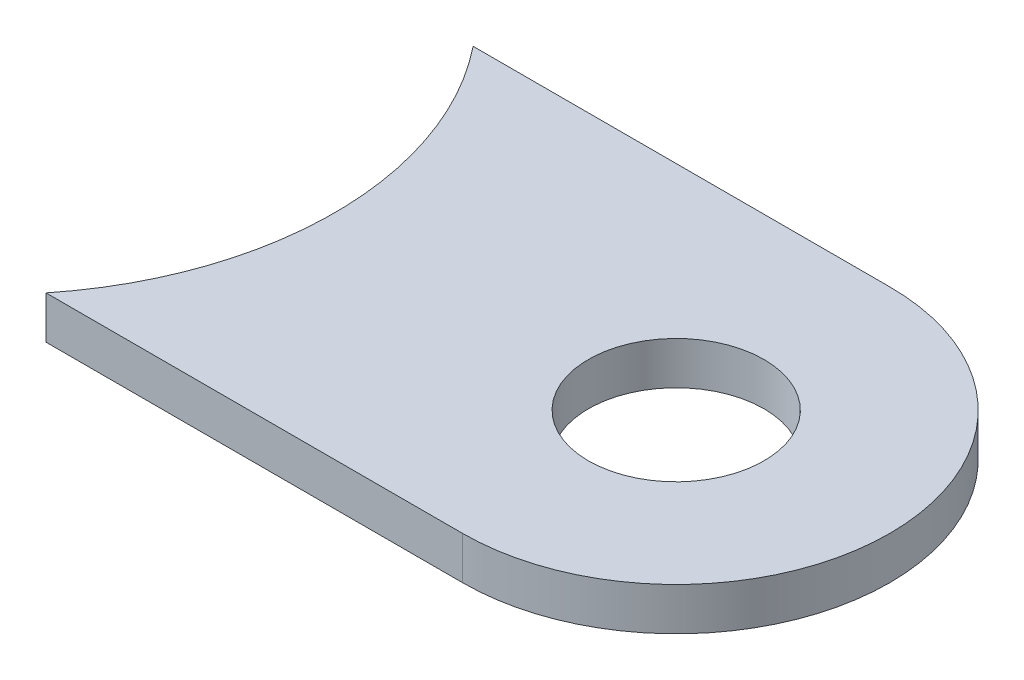
ISO-10303-21;
HEADER;
FILE_DESCRIPTION(('STEP AP214'),'2;1');
FILE_NAME('part.step','',(''),(''),'','','');
FILE_SCHEMA(('AUTOMOTIVE_DESIGN { 1 0 10303 214 1 1 1 1 }'));
ENDSEC;
DATA;
#1=APPLICATION_CONTEXT('core data for automotive mechanical design processes');
#2=APPLICATION_PROTOCOL_DEFINITION('international standard','automotive_design',2000,#1);
#3=PRODUCT_CONTEXT('',#1,'mechanical');
#4=PRODUCT('Part','Part','',(#3));
#5=PRODUCT_RELATED_PRODUCT_CATEGORY('part','',(#4));
#6=PRODUCT_DEFINITION_FORMATION('','',#4);
#7=PRODUCT_DEFINITION_CONTEXT('part definition',#1,'design');
#8=PRODUCT_DEFINITION('design','',#6,#7);
#9=PRODUCT_DEFINITION_SHAPE('','',#8);
#10=(LENGTH_UNIT() NAMED_UNIT(*) SI_UNIT(.MILLI.,.METRE.));
#11=(NAMED_UNIT(*) PLANE_ANGLE_UNIT() SI_UNIT($,.RADIAN.));
#12=(NAMED_UNIT(*) SI_UNIT($,.STERADIAN.) SOLID_ANGLE_UNIT());
#13=UNCERTAINTY_MEASURE_WITH_UNIT(LENGTH_MEASURE(1.E-05),#10,'distance_accuracy_value','');
#14=(GEOMETRIC_REPRESENTATION_CONTEXT(3) GLOBAL_UNCERTAINTY_ASSIGNED_CONTEXT((#13)) GLOBAL_UNIT_ASSIGNED_CONTEXT((#10,
#11,#12)) REPRESENTATION_CONTEXT('',''));
#15=CARTESIAN_POINT('',(0.,0.,0.));
#16=DIRECTION('',(0.,0.,1.));
#17=DIRECTION('',(1.,0.,0.));
#18=AXIS2_PLACEMENT_3D('',#15,#16,#17);
#19=CARTESIAN_POINT('',(0.,1.5875,0.));
#20=DIRECTION('',(0.,-1.,0.));
#21=DIRECTION('',(0.,0.,-1.));
#22=AXIS2_PLACEMENT_3D('',#19,#20,#21);
#23=PLANE('',#22);
#24=DIRECTION('',(-1.,0.,0.));
#25=VECTOR('',#24,1.);
#26=CARTESIAN_POINT('',(-25.4,1.5875,-7.9375));
#27=LINE('',#26,#25);
#28=CARTESIAN_POINT('',(0.,1.5875,-7.9375));
#29=VERTEX_POINT('',#28);
#30=CARTESIAN_POINT('',(-15.4860656775425,1.5875,-7.9375));
#31=VERTEX_POINT('',#30);
#32=EDGE_CURVE('E89',#29,#31,#27,.T.);
#33=ORIENTED_EDGE('',*,*,#32,.T.);
#34=CARTESIAN_POINT('',(-25.4,1.5875,0.));
#35=DIRECTION('',(0.,1.,0.));
#36=DIRECTION('',(0.,0.,1.));
#37=AXIS2_PLACEMENT_3D('',#34,#35,#36);
#38=CIRCLE('',#37,12.7);
#39=CARTESIAN_POINT('',(-15.4860656775425,1.5875,7.9375));
#40=VERTEX_POINT('',#39);
#41=EDGE_CURVE('E53',#40,#31,#38,.T.);
#42=ORIENTED_EDGE('',*,*,#41,.F.);
#43=DIRECTION('',(1.,0.,0.));
#44=VECTOR('',#43,1.);
#45=CARTESIAN_POINT('',(0.,1.5875,7.9375));
#46=LINE('',#45,#44);
#47=CARTESIAN_POINT('',(0.,1.5875,7.9375));
#48=VERTEX_POINT('',#47);
#49=EDGE_CURVE('E96',#40,#48,#46,.T.);
#50=ORIENTED_EDGE('',*,*,#49,.T.);
#51=CARTESIAN_POINT('',(0.,1.5875,0.));
#52=DIRECTION('',(0.,1.,0.));
#53=DIRECTION('',(0.,0.,-1.));
#54=AXIS2_PLACEMENT_3D('',#51,#52,#53);
#55=CIRCLE('',#54,7.9375);
#56=EDGE_CURVE('E61',#48,#29,#55,.T.);
#57=ORIENTED_EDGE('',*,*,#56,.T.);
#58=EDGE_LOOP('',(#33,#42,#50,#57));
#59=FACE_BOUND('',#58,.T.);
#60=CARTESIAN_POINT('',(0.,1.5875,0.));
#61=DIRECTION('',(0.,1.,0.));
#62=DIRECTION('',(0.,0.,1.));
#63=AXIS2_PLACEMENT_3D('',#60,#61,#62);
#64=CIRCLE('',#63,3.2639);
#65=CARTESIAN_POINT('',(0.,1.5875,3.2639));
#66=VERTEX_POINT('',#65);
#67=EDGE_CURVE('E101',#66,#66,#64,.T.);
#68=ORIENTED_EDGE('',*,*,#67,.F.);
#69=EDGE_LOOP('',(#68));
#70=FACE_BOUND('',#69,.T.);
#71=ADVANCED_FACE('F38',(#59,#70),#23,.F.);
#72=CARTESIAN_POINT('',(0.,0.,0.));
#73=DIRECTION('',(0.,-1.,0.));
#74=DIRECTION('',(0.,0.,-1.));
#75=AXIS2_PLACEMENT_3D('',#72,#73,#74);
#76=PLANE('',#75);
#77=CARTESIAN_POINT('',(-25.4,0.,0.));
#78=DIRECTION('',(0.,1.,0.));
#79=DIRECTION('',(0.,0.,1.));
#80=AXIS2_PLACEMENT_3D('',#77,#78,#79);
#81=CIRCLE('',#80,12.7);
#82=CARTESIAN_POINT('',(-15.4860656775425,0.,7.9375));
#83=VERTEX_POINT('',#82);
#84=CARTESIAN_POINT('',(-15.4860656775425,0.,-7.9375));
#85=VERTEX_POINT('',#84);
#86=EDGE_CURVE('E95',#83,#85,#81,.T.);
#87=ORIENTED_EDGE('',*,*,#86,.T.);
#88=DIRECTION('',(-1.,0.,0.));
#89=VECTOR('',#88,1.);
#90=CARTESIAN_POINT('',(-25.4,0.,-7.9375));
#91=LINE('',#90,#89);
#92=CARTESIAN_POINT('',(0.,0.,-7.9375));
#93=VERTEX_POINT('',#92);
#94=EDGE_CURVE('E83',#93,#85,#91,.T.);
#95=ORIENTED_EDGE('',*,*,#94,.F.);
#96=CARTESIAN_POINT('',(0.,0.,0.));
#97=DIRECTION('',(0.,1.,0.));
#98=DIRECTION('',(0.,0.,-1.));
#99=AXIS2_PLACEMENT_3D('',#96,#97,#98);
#100=CIRCLE('',#99,7.9375);
#101=CARTESIAN_POINT('',(0.,0.,7.9375));
#102=VERTEX_POINT('',#101);
#103=EDGE_CURVE('E74',#102,#93,#100,.T.);
#104=ORIENTED_EDGE('',*,*,#103,.F.);
#105=DIRECTION('',(1.,0.,0.));
#106=VECTOR('',#105,1.);
#107=CARTESIAN_POINT('',(0.,0.,7.9375));
#108=LINE('',#107,#106);
#109=EDGE_CURVE('E84',#83,#102,#108,.T.);
#110=ORIENTED_EDGE('',*,*,#109,.F.);
#111=EDGE_LOOP('',(#87,#95,#104,#110));
#112=FACE_BOUND('',#111,.T.);
#113=CARTESIAN_POINT('',(0.,0.,0.));
#114=DIRECTION('',(0.,1.,0.));
#115=DIRECTION('',(0.,0.,1.));
#116=AXIS2_PLACEMENT_3D('',#113,#114,#115);
#117=CIRCLE('',#116,3.2639);
#118=CARTESIAN_POINT('',(0.,0.,3.2639));
#119=VERTEX_POINT('',#118);
#120=EDGE_CURVE('E104',#119,#119,#117,.T.);
#121=ORIENTED_EDGE('',*,*,#120,.T.);
#122=EDGE_LOOP('',(#121));
#123=FACE_BOUND('',#122,.T.);
#124=ADVANCED_FACE('F92',(#112,#123),#76,.T.);
#125=CARTESIAN_POINT('',(0.,1.5875,7.9375));
#126=DIRECTION('',(0.,0.,-1.));
#127=DIRECTION('',(-1.,0.,0.));
#128=AXIS2_PLACEMENT_3D('',#125,#126,#127);
#129=PLANE('',#128);
#130=ORIENTED_EDGE('',*,*,#49,.F.);
#131=DIRECTION('',(0.,1.,0.));
#132=VECTOR('',#131,1.);
#133=CARTESIAN_POINT('',(-15.4860656775425,0.,7.9375));
#134=LINE('',#133,#132);
#135=EDGE_CURVE('E107',#40,#83,#134,.F.);
#136=ORIENTED_EDGE('',*,*,#135,.T.);
#137=ORIENTED_EDGE('',*,*,#109,.T.);
#138=DIRECTION('',(0.,-1.,0.));
#139=VECTOR('',#138,1.);
#140=CARTESIAN_POINT('',(0.,1.5875,7.9375));
#141=LINE('',#140,#139);
#142=EDGE_CURVE('E46',#48,#102,#141,.T.);
#143=ORIENTED_EDGE('',*,*,#142,.F.);
#144=EDGE_LOOP('',(#130,#136,#137,#143));
#145=FACE_BOUND('',#144,.T.);
#146=ADVANCED_FACE('F40',(#145),#129,.F.);
#147=CARTESIAN_POINT('',(0.,1.5875,0.));
#148=DIRECTION('',(0.,-1.,0.));
#149=DIRECTION('',(0.,0.,-1.));
#150=AXIS2_PLACEMENT_3D('',#147,#148,#149);
#151=CYLINDRICAL_SURFACE('',#150,7.9375);
#152=ORIENTED_EDGE('',*,*,#103,.T.);
#153=DIRECTION('',(0.,-1.,0.));
#154=VECTOR('',#153,1.);
#155=CARTESIAN_POINT('',(0.,1.5875,-7.9375));
#156=LINE('',#155,#154);
#157=EDGE_CURVE('E77',#29,#93,#156,.T.);
#158=ORIENTED_EDGE('',*,*,#157,.F.);
#159=ORIENTED_EDGE('',*,*,#56,.F.);
#160=ORIENTED_EDGE('',*,*,#142,.T.);
#161=EDGE_LOOP('',(#152,#158,#159,#160));
#162=FACE_BOUND('',#161,.T.);
#163=ADVANCED_FACE('F76',(#162),#151,.T.);
#164=CARTESIAN_POINT('',(-25.4,1.5875,-7.9375));
#165=DIRECTION('',(0.,0.,1.));
#166=DIRECTION('',(1.,0.,0.));
#167=AXIS2_PLACEMENT_3D('',#164,#165,#166);
#168=PLANE('',#167);
#169=ORIENTED_EDGE('',*,*,#94,.T.);
#170=DIRECTION('',(0.,1.,0.));
#171=VECTOR('',#170,1.);
#172=CARTESIAN_POINT('',(-15.4860656775425,0.,-7.9375));
#173=LINE('',#172,#171);
#174=EDGE_CURVE('E11',#85,#31,#173,.T.);
#175=ORIENTED_EDGE('',*,*,#174,.T.);
#176=ORIENTED_EDGE('',*,*,#32,.F.);
#177=ORIENTED_EDGE('',*,*,#157,.T.);
#178=EDGE_LOOP('',(#169,#175,#176,#177));
#179=FACE_BOUND('',#178,.T.);
#180=ADVANCED_FACE('F88',(#179),#168,.F.);
#181=CARTESIAN_POINT('',(0.,1.5875,0.));
#182=DIRECTION('',(0.,-1.,0.));
#183=DIRECTION('',(0.,0.,-1.));
#184=AXIS2_PLACEMENT_3D('',#181,#182,#183);
#185=CYLINDRICAL_SURFACE('',#184,3.2639);
#186=ORIENTED_EDGE('',*,*,#67,.T.);
#187=EDGE_LOOP('',(#186));
#188=FACE_BOUND('',#187,.T.);
#189=ORIENTED_EDGE('',*,*,#120,.F.);
#190=EDGE_LOOP('',(#189));
#191=FACE_BOUND('',#190,.T.);
#192=ADVANCED_FACE('F125',(#188,#191),#185,.F.);
#193=CARTESIAN_POINT('',(-25.4,0.,0.));
#194=DIRECTION('',(0.,1.,0.));
#195=DIRECTION('',(0.,0.,1.));
#196=AXIS2_PLACEMENT_3D('',#193,#194,#195);
#197=CYLINDRICAL_SURFACE('',#196,12.7);
#198=ORIENTED_EDGE('',*,*,#41,.T.);
#199=ORIENTED_EDGE('',*,*,#174,.F.);
#200=ORIENTED_EDGE('',*,*,#86,.F.);
#201=ORIENTED_EDGE('',*,*,#135,.F.);
#202=EDGE_LOOP('',(#198,#199,#200,#201));
#203=FACE_BOUND('',#202,.T.);
#204=ADVANCED_FACE('F118',(#203),#197,.F.);
#205=CLOSED_SHELL('',(#71,#124,#146,#163,#180,#192,#204));
#206=MANIFOLD_SOLID_BREP('B2',#205);
#207=ADVANCED_BREP_SHAPE_REPRESENTATION('',(#18,#206),#14);
#208=SHAPE_DEFINITION_REPRESENTATION(#9,#207);
ENDSEC;
END-ISO-10303-21;
